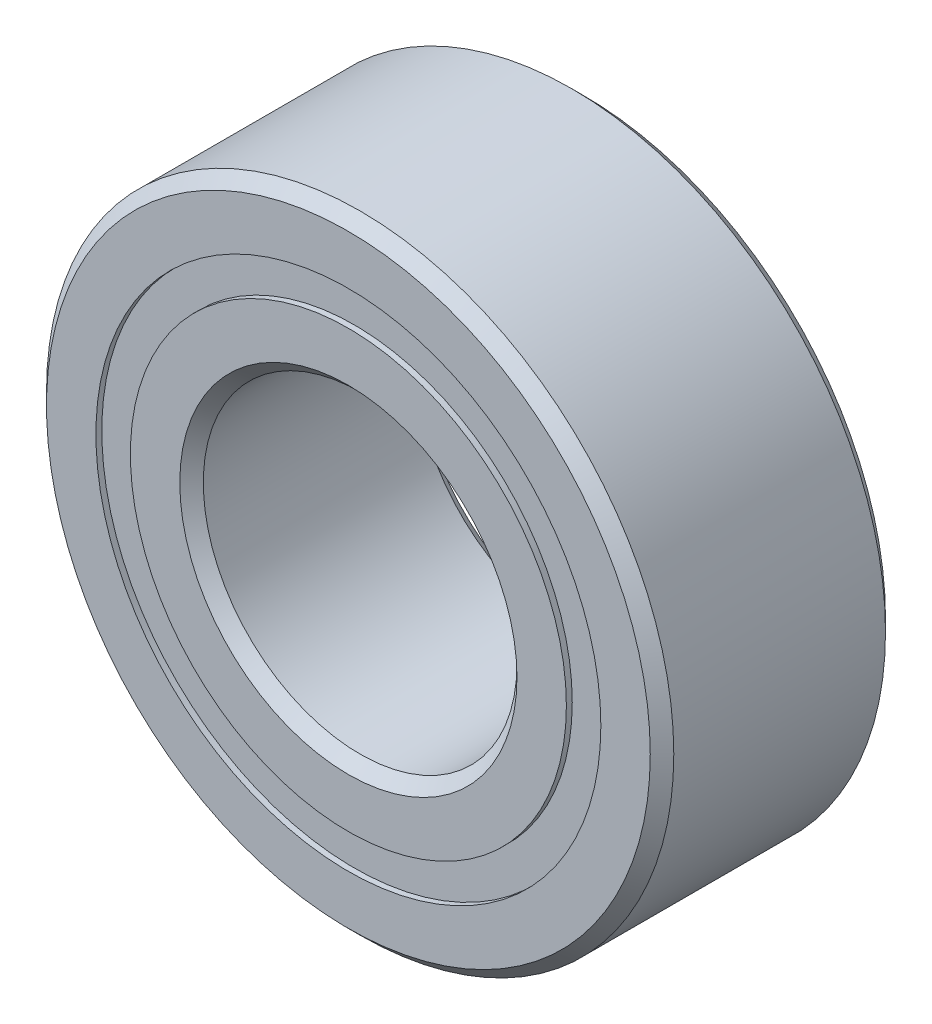
ISO-10303-21;
HEADER;
FILE_DESCRIPTION(('STEP AP214'),'2;1');
FILE_NAME('part.step','',(''),(''),'','','');
FILE_SCHEMA(('AUTOMOTIVE_DESIGN { 1 0 10303 214 1 1 1 1 }'));
ENDSEC;
DATA;
#1=APPLICATION_CONTEXT('core data for automotive mechanical design processes');
#2=APPLICATION_PROTOCOL_DEFINITION('international standard','automotive_design',2000,#1);
#3=PRODUCT_CONTEXT('',#1,'mechanical');
#4=PRODUCT('Part','Part','',(#3));
#5=PRODUCT_RELATED_PRODUCT_CATEGORY('part','',(#4));
#6=PRODUCT_DEFINITION_FORMATION('','',#4);
#7=PRODUCT_DEFINITION_CONTEXT('part definition',#1,'design');
#8=PRODUCT_DEFINITION('design','',#6,#7);
#9=PRODUCT_DEFINITION_SHAPE('','',#8);
#10=(LENGTH_UNIT() NAMED_UNIT(*) SI_UNIT(.MILLI.,.METRE.));
#11=(NAMED_UNIT(*) PLANE_ANGLE_UNIT() SI_UNIT($,.RADIAN.));
#12=(NAMED_UNIT(*) SI_UNIT($,.STERADIAN.) SOLID_ANGLE_UNIT());
#13=UNCERTAINTY_MEASURE_WITH_UNIT(LENGTH_MEASURE(1.E-05),#10,'distance_accuracy_value','');
#14=(GEOMETRIC_REPRESENTATION_CONTEXT(3) GLOBAL_UNCERTAINTY_ASSIGNED_CONTEXT((#13)) GLOBAL_UNIT_ASSIGNED_CONTEXT((#10,
#11,#12)) REPRESENTATION_CONTEXT('',''));
#15=CARTESIAN_POINT('',(0.,0.,0.));
#16=DIRECTION('',(0.,0.,1.));
#17=DIRECTION('',(1.,0.,0.));
#18=AXIS2_PLACEMENT_3D('',#15,#16,#17);
#19=CARTESIAN_POINT('',(0.,6.43956043956044,-2.85));
#20=DIRECTION('',(0.,0.,1.));
#21=DIRECTION('',(1.,0.,0.));
#22=AXIS2_PLACEMENT_3D('',#19,#20,#21);
#23=PLANE('',#22);
#24=CARTESIAN_POINT('',(0.,0.,-2.85));
#25=DIRECTION('',(0.,0.,1.));
#26=DIRECTION('',(1.,0.,0.));
#27=AXIS2_PLACEMENT_3D('',#24,#25,#26);
#28=CIRCLE('',#27,6.43956043956044);
#29=CARTESIAN_POINT('',(6.43956043956044,0.,-2.85));
#30=VERTEX_POINT('',#29);
#31=EDGE_CURVE('E55',#30,#30,#28,.T.);
#32=ORIENTED_EDGE('',*,*,#31,.F.);
#33=EDGE_LOOP('',(#32));
#34=FACE_BOUND('',#33,.T.);
#35=CARTESIAN_POINT('',(0.,0.,-2.85));
#36=DIRECTION('',(0.,0.,1.));
#37=DIRECTION('',(1.,0.,0.));
#38=AXIS2_PLACEMENT_3D('',#35,#36,#37);
#39=CIRCLE('',#38,5.56043956043956);
#40=CARTESIAN_POINT('',(5.56043956043956,0.,-2.85));
#41=VERTEX_POINT('',#40);
#42=EDGE_CURVE('E11',#41,#41,#39,.T.);
#43=ORIENTED_EDGE('',*,*,#42,.T.);
#44=EDGE_LOOP('',(#43));
#45=FACE_BOUND('',#44,.T.);
#46=ADVANCED_FACE('F41',(#34,#45),#23,.F.);
#47=CARTESIAN_POINT('',(0.,0.,3.));
#48=DIRECTION('',(0.,0.,1.));
#49=DIRECTION('',(1.,0.,0.));
#50=AXIS2_PLACEMENT_3D('',#47,#48,#49);
#51=CYLINDRICAL_SURFACE('',#50,5.56043956043956);
#52=ORIENTED_EDGE('',*,*,#42,.F.);
#53=EDGE_LOOP('',(#52));
#54=FACE_BOUND('',#53,.T.);
#55=CARTESIAN_POINT('',(0.,0.,-1.40391992570956));
#56=DIRECTION('',(0.,0.,1.));
#57=DIRECTION('',(1.,0.,0.));
#58=AXIS2_PLACEMENT_3D('',#55,#56,#57);
#59=CIRCLE('',#58,5.56043956043956);
#60=CARTESIAN_POINT('',(5.56043956043956,0.,-1.40391992570956));
#61=VERTEX_POINT('',#60);
#62=EDGE_CURVE('E47',#61,#61,#59,.T.);
#63=ORIENTED_EDGE('',*,*,#62,.T.);
#64=EDGE_LOOP('',(#63));
#65=FACE_BOUND('',#64,.T.);
#66=ADVANCED_FACE('F64',(#54,#65),#51,.F.);
#67=CARTESIAN_POINT('',(0.,6.43956043956044,-1.40391992570956));
#68=DIRECTION('',(0.,0.,-1.));
#69=DIRECTION('',(-1.,0.,0.));
#70=AXIS2_PLACEMENT_3D('',#67,#68,#69);
#71=PLANE('',#70);
#72=ORIENTED_EDGE('',*,*,#62,.F.);
#73=EDGE_LOOP('',(#72));
#74=FACE_BOUND('',#73,.T.);
#75=CARTESIAN_POINT('',(0.,0.,-1.40391992570956));
#76=DIRECTION('',(0.,0.,1.));
#77=DIRECTION('',(1.,0.,0.));
#78=AXIS2_PLACEMENT_3D('',#75,#76,#77);
#79=CIRCLE('',#78,6.43956043956044);
#80=CARTESIAN_POINT('',(6.43956043956044,0.,-1.40391992570956));
#81=VERTEX_POINT('',#80);
#82=EDGE_CURVE('E51',#81,#81,#79,.T.);
#83=ORIENTED_EDGE('',*,*,#82,.T.);
#84=EDGE_LOOP('',(#83));
#85=FACE_BOUND('',#84,.T.);
#86=ADVANCED_FACE('F68',(#74,#85),#71,.F.);
#87=CARTESIAN_POINT('',(0.,0.,3.));
#88=DIRECTION('',(0.,0.,1.));
#89=DIRECTION('',(1.,0.,0.));
#90=AXIS2_PLACEMENT_3D('',#87,#88,#89);
#91=CYLINDRICAL_SURFACE('',#90,6.43956043956044);
#92=ORIENTED_EDGE('',*,*,#82,.F.);
#93=EDGE_LOOP('',(#92));
#94=FACE_BOUND('',#93,.T.);
#95=ORIENTED_EDGE('',*,*,#31,.T.);
#96=EDGE_LOOP('',(#95));
#97=FACE_BOUND('',#96,.T.);
#98=ADVANCED_FACE('F61',(#94,#97),#91,.T.);
#99=CLOSED_SHELL('',(#46,#66,#86,#98));
#100=MANIFOLD_SOLID_BREP('B2',#99);
#101=CARTESIAN_POINT('',(0.,6.43956043956044,2.85));
#102=DIRECTION('',(0.,0.,-1.));
#103=DIRECTION('',(-1.,0.,0.));
#104=AXIS2_PLACEMENT_3D('',#101,#102,#103);
#105=PLANE('',#104);
#106=CARTESIAN_POINT('',(0.,0.,2.85));
#107=DIRECTION('',(0.,0.,1.));
#108=DIRECTION('',(1.,0.,0.));
#109=AXIS2_PLACEMENT_3D('',#106,#107,#108);
#110=CIRCLE('',#109,5.56043956043956);
#111=CARTESIAN_POINT('',(5.56043956043956,0.,2.85));
#112=VERTEX_POINT('',#111);
#113=EDGE_CURVE('E40',#112,#112,#110,.T.);
#114=ORIENTED_EDGE('',*,*,#113,.F.);
#115=EDGE_LOOP('',(#114));
#116=FACE_BOUND('',#115,.T.);
#117=CARTESIAN_POINT('',(0.,0.,2.85));
#118=DIRECTION('',(0.,0.,1.));
#119=DIRECTION('',(1.,0.,0.));
#120=AXIS2_PLACEMENT_3D('',#117,#118,#119);
#121=CIRCLE('',#120,6.43956043956044);
#122=CARTESIAN_POINT('',(6.43956043956044,0.,2.85));
#123=VERTEX_POINT('',#122);
#124=EDGE_CURVE('E122',#123,#123,#121,.T.);
#125=ORIENTED_EDGE('',*,*,#124,.T.);
#126=EDGE_LOOP('',(#125));
#127=FACE_BOUND('',#126,.T.);
#128=ADVANCED_FACE('F108',(#116,#127),#105,.F.);
#129=CARTESIAN_POINT('',(0.,0.,3.));
#130=DIRECTION('',(0.,0.,1.));
#131=DIRECTION('',(1.,0.,0.));
#132=AXIS2_PLACEMENT_3D('',#129,#130,#131);
#133=CYLINDRICAL_SURFACE('',#132,5.56043956043956);
#134=CARTESIAN_POINT('',(0.,0.,1.40391992570956));
#135=DIRECTION('',(0.,0.,1.));
#136=DIRECTION('',(1.,0.,0.));
#137=AXIS2_PLACEMENT_3D('',#134,#135,#136);
#138=CIRCLE('',#137,5.56043956043956);
#139=CARTESIAN_POINT('',(5.56043956043956,0.,1.40391992570956));
#140=VERTEX_POINT('',#139);
#141=EDGE_CURVE('E114',#140,#140,#138,.T.);
#142=ORIENTED_EDGE('',*,*,#141,.F.);
#143=EDGE_LOOP('',(#142));
#144=FACE_BOUND('',#143,.T.);
#145=ORIENTED_EDGE('',*,*,#113,.T.);
#146=EDGE_LOOP('',(#145));
#147=FACE_BOUND('',#146,.T.);
#148=ADVANCED_FACE('F137',(#144,#147),#133,.F.);
#149=CARTESIAN_POINT('',(0.,6.43956043956044,1.40391992570956));
#150=DIRECTION('',(0.,0.,1.));
#151=DIRECTION('',(1.,0.,0.));
#152=AXIS2_PLACEMENT_3D('',#149,#150,#151);
#153=PLANE('',#152);
#154=CARTESIAN_POINT('',(0.,0.,1.40391992570956));
#155=DIRECTION('',(0.,0.,1.));
#156=DIRECTION('',(1.,0.,0.));
#157=AXIS2_PLACEMENT_3D('',#154,#155,#156);
#158=CIRCLE('',#157,6.43956043956044);
#159=CARTESIAN_POINT('',(6.43956043956044,0.,1.40391992570956));
#160=VERTEX_POINT('',#159);
#161=EDGE_CURVE('E118',#160,#160,#158,.T.);
#162=ORIENTED_EDGE('',*,*,#161,.F.);
#163=EDGE_LOOP('',(#162));
#164=FACE_BOUND('',#163,.T.);
#165=ORIENTED_EDGE('',*,*,#141,.T.);
#166=EDGE_LOOP('',(#165));
#167=FACE_BOUND('',#166,.T.);
#168=ADVANCED_FACE('F132',(#164,#167),#153,.F.);
#169=CARTESIAN_POINT('',(0.,0.,3.));
#170=DIRECTION('',(0.,0.,1.));
#171=DIRECTION('',(1.,0.,0.));
#172=AXIS2_PLACEMENT_3D('',#169,#170,#171);
#173=CYLINDRICAL_SURFACE('',#172,6.43956043956044);
#174=ORIENTED_EDGE('',*,*,#124,.F.);
#175=EDGE_LOOP('',(#174));
#176=FACE_BOUND('',#175,.T.);
#177=ORIENTED_EDGE('',*,*,#161,.T.);
#178=EDGE_LOOP('',(#177));
#179=FACE_BOUND('',#178,.T.);
#180=ADVANCED_FACE('F129',(#176,#179),#173,.T.);
#181=CLOSED_SHELL('',(#128,#148,#168,#180));
#182=MANIFOLD_SOLID_BREP('B6',#181);
#183=CARTESIAN_POINT('',(-2.99999999999993,5.19615242270667,0.));
#184=DIRECTION('',(0.,0.,1.));
#185=DIRECTION('',(-0.499999999999989,0.866025403784445,0.));
#186=AXIS2_PLACEMENT_3D('',#183,#184,#185);
#187=SPHERICAL_SURFACE('',#186,1.40391992570956);
#188=CARTESIAN_POINT('',(-2.99999999999993,5.19615242270667,1.40391992570956));
#189=VERTEX_POINT('',#188);
#190=VERTEX_LOOP('',#189);
#191=FACE_BOUND('',#190,.T.);
#192=ADVANCED_FACE('F175',(#191),#187,.T.);
#193=CLOSED_SHELL('',(#192));
#194=MANIFOLD_SOLID_BREP('B35',#193);
#195=CARTESIAN_POINT('',(-5.1961524227066,3.00000000000006,0.));
#196=DIRECTION('',(0.,0.,1.));
#197=DIRECTION('',(-0.866025403784433,0.50000000000001,0.));
#198=AXIS2_PLACEMENT_3D('',#195,#196,#197);
#199=SPHERICAL_SURFACE('',#198,1.40391992570956);
#200=CARTESIAN_POINT('',(-5.1961524227066,3.00000000000006,1.40391992570956));
#201=VERTEX_POINT('',#200);
#202=VERTEX_LOOP('',#201);
#203=FACE_BOUND('',#202,.T.);
#204=ADVANCED_FACE('F195',(#203),#199,.T.);
#205=CLOSED_SHELL('',(#204));
#206=MANIFOLD_SOLID_BREP('B104',#205);
#207=CARTESIAN_POINT('',(-6.,0.,0.));
#208=DIRECTION('',(0.,0.,1.));
#209=DIRECTION('',(-1.,0.,0.));
#210=AXIS2_PLACEMENT_3D('',#207,#208,#209);
#211=SPHERICAL_SURFACE('',#210,1.40391992570956);
#212=CARTESIAN_POINT('',(-6.,0.,1.40391992570956));
#213=VERTEX_POINT('',#212);
#214=VERTEX_LOOP('',#213);
#215=FACE_BOUND('',#214,.T.);
#216=ADVANCED_FACE('F215',(#215),#211,.T.);
#217=CLOSED_SHELL('',(#216));
#218=MANIFOLD_SOLID_BREP('B171',#217);
#219=CARTESIAN_POINT('',(-5.19615242270666,-2.99999999999995,0.));
#220=DIRECTION('',(0.,0.,1.));
#221=DIRECTION('',(-0.866025403784443,-0.499999999999992,0.));
#222=AXIS2_PLACEMENT_3D('',#219,#220,#221);
#223=SPHERICAL_SURFACE('',#222,1.40391992570956);
#224=CARTESIAN_POINT('',(-5.19615242270666,-2.99999999999995,1.40391992570956));
#225=VERTEX_POINT('',#224);
#226=VERTEX_LOOP('',#225);
#227=FACE_BOUND('',#226,.T.);
#228=ADVANCED_FACE('F235',(#227),#223,.T.);
#229=CLOSED_SHELL('',(#228));
#230=MANIFOLD_SOLID_BREP('B191',#229);
#231=CARTESIAN_POINT('',(-3.00000000000004,-5.19615242270661,0.));
#232=DIRECTION('',(0.,0.,1.));
#233=DIRECTION('',(-0.500000000000007,-0.866025403784435,0.));
#234=AXIS2_PLACEMENT_3D('',#231,#232,#233);
#235=SPHERICAL_SURFACE('',#234,1.40391992570956);
#236=CARTESIAN_POINT('',(-3.00000000000004,-5.19615242270661,1.40391992570956));
#237=VERTEX_POINT('',#236);
#238=VERTEX_LOOP('',#237);
#239=FACE_BOUND('',#238,.T.);
#240=ADVANCED_FACE('F255',(#239),#235,.T.);
#241=CLOSED_SHELL('',(#240));
#242=MANIFOLD_SOLID_BREP('B211',#241);
#243=CARTESIAN_POINT('',(0.,-6.,0.));
#244=DIRECTION('',(0.,0.,1.));
#245=DIRECTION('',(0.,-1.,0.));
#246=AXIS2_PLACEMENT_3D('',#243,#244,#245);
#247=SPHERICAL_SURFACE('',#246,1.40391992570956);
#248=CARTESIAN_POINT('',(0.,-6.,1.40391992570956));
#249=VERTEX_POINT('',#248);
#250=VERTEX_LOOP('',#249);
#251=FACE_BOUND('',#250,.T.);
#252=ADVANCED_FACE('F275',(#251),#247,.T.);
#253=CLOSED_SHELL('',(#252));
#254=MANIFOLD_SOLID_BREP('B231',#253);
#255=CARTESIAN_POINT('',(2.99999999999997,-5.19615242270665,0.));
#256=DIRECTION('',(0.,0.,1.));
#257=DIRECTION('',(0.499999999999995,-0.866025403784442,0.));
#258=AXIS2_PLACEMENT_3D('',#255,#256,#257);
#259=SPHERICAL_SURFACE('',#258,1.40391992570956);
#260=CARTESIAN_POINT('',(2.99999999999997,-5.19615242270665,1.40391992570956));
#261=VERTEX_POINT('',#260);
#262=VERTEX_LOOP('',#261);
#263=FACE_BOUND('',#262,.T.);
#264=ADVANCED_FACE('F295',(#263),#259,.T.);
#265=CLOSED_SHELL('',(#264));
#266=MANIFOLD_SOLID_BREP('B251',#265);
#267=CARTESIAN_POINT('',(5.19615242270662,-3.00000000000002,0.));
#268=DIRECTION('',(0.,0.,1.));
#269=DIRECTION('',(0.866025403784436,-0.500000000000004,0.));
#270=AXIS2_PLACEMENT_3D('',#267,#268,#269);
#271=SPHERICAL_SURFACE('',#270,1.40391992570956);
#272=CARTESIAN_POINT('',(5.19615242270662,-3.00000000000002,1.40391992570956));
#273=VERTEX_POINT('',#272);
#274=VERTEX_LOOP('',#273);
#275=FACE_BOUND('',#274,.T.);
#276=ADVANCED_FACE('F315',(#275),#271,.T.);
#277=CLOSED_SHELL('',(#276));
#278=MANIFOLD_SOLID_BREP('B271',#277);
#279=CARTESIAN_POINT('',(6.,0.,0.));
#280=DIRECTION('',(0.,0.,1.));
#281=DIRECTION('',(1.,0.,0.));
#282=AXIS2_PLACEMENT_3D('',#279,#280,#281);
#283=SPHERICAL_SURFACE('',#282,1.40391992570956);
#284=CARTESIAN_POINT('',(6.,0.,1.40391992570956));
#285=VERTEX_POINT('',#284);
#286=VERTEX_LOOP('',#285);
#287=FACE_BOUND('',#286,.T.);
#288=ADVANCED_FACE('F335',(#287),#283,.T.);
#289=CLOSED_SHELL('',(#288));
#290=MANIFOLD_SOLID_BREP('B291',#289);
#291=CARTESIAN_POINT('',(5.19615242270664,2.99999999999999,0.));
#292=DIRECTION('',(0.,0.,1.));
#293=DIRECTION('',(0.86602540378444,0.499999999999998,0.));
#294=AXIS2_PLACEMENT_3D('',#291,#292,#293);
#295=SPHERICAL_SURFACE('',#294,1.40391992570956);
#296=CARTESIAN_POINT('',(5.19615242270664,2.99999999999999,1.40391992570956));
#297=VERTEX_POINT('',#296);
#298=VERTEX_LOOP('',#297);
#299=FACE_BOUND('',#298,.T.);
#300=ADVANCED_FACE('F355',(#299),#295,.T.);
#301=CLOSED_SHELL('',(#300));
#302=MANIFOLD_SOLID_BREP('B311',#301);
#303=CARTESIAN_POINT('',(3.00000000000001,5.19615242270663,0.));
#304=DIRECTION('',(0.,0.,1.));
#305=DIRECTION('',(0.500000000000001,0.866025403784438,0.));
#306=AXIS2_PLACEMENT_3D('',#303,#304,#305);
#307=SPHERICAL_SURFACE('',#306,1.40391992570956);
#308=CARTESIAN_POINT('',(3.00000000000001,5.19615242270663,1.40391992570956));
#309=VERTEX_POINT('',#308);
#310=VERTEX_LOOP('',#309);
#311=FACE_BOUND('',#310,.T.);
#312=ADVANCED_FACE('F375',(#311),#307,.T.);
#313=CLOSED_SHELL('',(#312));
#314=MANIFOLD_SOLID_BREP('B331',#313);
#315=CARTESIAN_POINT('',(0.,6.,0.));
#316=DIRECTION('',(0.,0.,1.));
#317=DIRECTION('',(0.,1.,0.));
#318=AXIS2_PLACEMENT_3D('',#315,#316,#317);
#319=SPHERICAL_SURFACE('',#318,1.40391992570956);
#320=CARTESIAN_POINT('',(0.,6.,1.40391992570956));
#321=VERTEX_POINT('',#320);
#322=VERTEX_LOOP('',#321);
#323=FACE_BOUND('',#322,.T.);
#324=ADVANCED_FACE('F397',(#323),#319,.T.);
#325=CLOSED_SHELL('',(#324));
#326=MANIFOLD_SOLID_BREP('B351',#325);
#327=CARTESIAN_POINT('',(0.,5.56043956043956,3.));
#328=DIRECTION('',(0.,0.,-1.));
#329=DIRECTION('',(-1.,0.,0.));
#330=AXIS2_PLACEMENT_3D('',#327,#328,#329);
#331=PLANE('',#330);
#332=CARTESIAN_POINT('',(0.,0.,3.));
#333=DIRECTION('',(0.,0.,1.));
#334=DIRECTION('',(1.,0.,0.));
#335=AXIS2_PLACEMENT_3D('',#332,#333,#334);
#336=CIRCLE('',#335,4.3);
#337=CARTESIAN_POINT('',(4.3,0.,3.));
#338=VERTEX_POINT('',#337);
#339=EDGE_CURVE('E444',#338,#338,#336,.T.);
#340=ORIENTED_EDGE('',*,*,#339,.F.);
#341=EDGE_LOOP('',(#340));
#342=FACE_BOUND('',#341,.T.);
#343=CARTESIAN_POINT('',(0.,0.,3.));
#344=DIRECTION('',(0.,0.,1.));
#345=DIRECTION('',(1.,0.,0.));
#346=AXIS2_PLACEMENT_3D('',#343,#344,#345);
#347=CIRCLE('',#346,5.56043956043956);
#348=CARTESIAN_POINT('',(5.56043956043956,0.,3.));
#349=VERTEX_POINT('',#348);
#350=EDGE_CURVE('E396',#349,#349,#347,.T.);
#351=ORIENTED_EDGE('',*,*,#350,.T.);
#352=EDGE_LOOP('',(#351));
#353=FACE_BOUND('',#352,.T.);
#354=ADVANCED_FACE('F416',(#342,#353),#331,.F.);
#355=CARTESIAN_POINT('',(0.,0.,3.));
#356=DIRECTION('',(0.,0.,1.));
#357=DIRECTION('',(1.,0.,0.));
#358=AXIS2_PLACEMENT_3D('',#355,#356,#357);
#359=CYLINDRICAL_SURFACE('',#358,5.56043956043956);
#360=ORIENTED_EDGE('',*,*,#350,.F.);
#361=EDGE_LOOP('',(#360));
#362=FACE_BOUND('',#361,.T.);
#363=CARTESIAN_POINT('',(0.,0.,1.33333333333333));
#364=DIRECTION('',(0.,0.,1.));
#365=DIRECTION('',(1.,0.,0.));
#366=AXIS2_PLACEMENT_3D('',#363,#364,#365);
#367=CIRCLE('',#366,5.56043956043956);
#368=CARTESIAN_POINT('',(5.56043956043956,0.,1.33333333333333));
#369=VERTEX_POINT('',#368);
#370=EDGE_CURVE('E422',#369,#369,#367,.T.);
#371=ORIENTED_EDGE('',*,*,#370,.T.);
#372=EDGE_LOOP('',(#371));
#373=FACE_BOUND('',#372,.T.);
#374=ADVANCED_FACE('F451',(#362,#373),#359,.T.);
#375=CARTESIAN_POINT('',(0.,0.,0.));
#376=DIRECTION('',(0.,0.,1.));
#377=DIRECTION('',(1.,0.,0.));
#378=AXIS2_PLACEMENT_3D('',#375,#376,#377);
#379=TOROIDAL_SURFACE('',#378,6.,1.40391992570956);
#380=ORIENTED_EDGE('',*,*,#370,.F.);
#381=EDGE_LOOP('',(#380));
#382=FACE_BOUND('',#381,.T.);
#383=CARTESIAN_POINT('',(0.,0.,-1.33333333333333));
#384=DIRECTION('',(0.,0.,1.));
#385=DIRECTION('',(1.,0.,0.));
#386=AXIS2_PLACEMENT_3D('',#383,#384,#385);
#387=CIRCLE('',#386,5.56043956043956);
#388=CARTESIAN_POINT('',(5.56043956043956,0.,-1.33333333333333));
#389=VERTEX_POINT('',#388);
#390=EDGE_CURVE('E426',#389,#389,#387,.T.);
#391=ORIENTED_EDGE('',*,*,#390,.T.);
#392=EDGE_LOOP('',(#391));
#393=FACE_BOUND('',#392,.T.);
#394=ADVANCED_FACE('F455',(#382,#393),#379,.F.);
#395=CARTESIAN_POINT('',(0.,0.,3.));
#396=DIRECTION('',(0.,0.,1.));
#397=DIRECTION('',(1.,0.,0.));
#398=AXIS2_PLACEMENT_3D('',#395,#396,#397);
#399=CYLINDRICAL_SURFACE('',#398,5.56043956043956);
#400=ORIENTED_EDGE('',*,*,#390,.F.);
#401=EDGE_LOOP('',(#400));
#402=FACE_BOUND('',#401,.T.);
#403=CARTESIAN_POINT('',(0.,0.,-3.));
#404=DIRECTION('',(0.,0.,1.));
#405=DIRECTION('',(1.,0.,0.));
#406=AXIS2_PLACEMENT_3D('',#403,#404,#405);
#407=CIRCLE('',#406,5.56043956043956);
#408=CARTESIAN_POINT('',(5.56043956043956,0.,-3.));
#409=VERTEX_POINT('',#408);
#410=EDGE_CURVE('E430',#409,#409,#407,.T.);
#411=ORIENTED_EDGE('',*,*,#410,.T.);
#412=EDGE_LOOP('',(#411));
#413=FACE_BOUND('',#412,.T.);
#414=ADVANCED_FACE('F460',(#402,#413),#399,.T.);
#415=CARTESIAN_POINT('',(0.,4.3,-3.));
#416=DIRECTION('',(0.,0.,1.));
#417=DIRECTION('',(1.,0.,0.));
#418=AXIS2_PLACEMENT_3D('',#415,#416,#417);
#419=PLANE('',#418);
#420=ORIENTED_EDGE('',*,*,#410,.F.);
#421=EDGE_LOOP('',(#420));
#422=FACE_BOUND('',#421,.T.);
#423=CARTESIAN_POINT('',(0.,0.,-3.));
#424=DIRECTION('',(0.,0.,1.));
#425=DIRECTION('',(1.,0.,0.));
#426=AXIS2_PLACEMENT_3D('',#423,#424,#425);
#427=CIRCLE('',#426,4.3);
#428=CARTESIAN_POINT('',(4.3,0.,-3.));
#429=VERTEX_POINT('',#428);
#430=EDGE_CURVE('E435',#429,#429,#427,.T.);
#431=ORIENTED_EDGE('',*,*,#430,.T.);
#432=EDGE_LOOP('',(#431));
#433=FACE_BOUND('',#432,.T.);
#434=ADVANCED_FACE('F466',(#422,#433),#419,.F.);
#435=CARTESIAN_POINT('',(0.,0.,-2.7));
#436=DIRECTION('',(0.,0.,-1.));
#437=DIRECTION('',(-1.,0.,0.));
#438=AXIS2_PLACEMENT_3D('',#435,#436,#437);
#439=CONICAL_SURFACE('',#438,4.,0.785398163397445);
#440=ORIENTED_EDGE('',*,*,#430,.F.);
#441=EDGE_LOOP('',(#440));
#442=FACE_BOUND('',#441,.T.);
#443=CARTESIAN_POINT('',(0.,0.,-2.7));
#444=DIRECTION('',(0.,0.,1.));
#445=DIRECTION('',(1.,0.,0.));
#446=AXIS2_PLACEMENT_3D('',#443,#444,#445);
#447=CIRCLE('',#446,4.);
#448=CARTESIAN_POINT('',(4.,0.,-2.7));
#449=VERTEX_POINT('',#448);
#450=EDGE_CURVE('E438',#449,#449,#447,.T.);
#451=ORIENTED_EDGE('',*,*,#450,.T.);
#452=EDGE_LOOP('',(#451));
#453=FACE_BOUND('',#452,.T.);
#454=ADVANCED_FACE('F470',(#442,#453),#439,.F.);
#455=CARTESIAN_POINT('',(0.,0.,3.));
#456=DIRECTION('',(0.,0.,1.));
#457=DIRECTION('',(1.,0.,0.));
#458=AXIS2_PLACEMENT_3D('',#455,#456,#457);
#459=CYLINDRICAL_SURFACE('',#458,4.);
#460=ORIENTED_EDGE('',*,*,#450,.F.);
#461=EDGE_LOOP('',(#460));
#462=FACE_BOUND('',#461,.T.);
#463=CARTESIAN_POINT('',(0.,0.,2.7));
#464=DIRECTION('',(0.,0.,1.));
#465=DIRECTION('',(1.,0.,0.));
#466=AXIS2_PLACEMENT_3D('',#463,#464,#465);
#467=CIRCLE('',#466,4.);
#468=CARTESIAN_POINT('',(4.,0.,2.7));
#469=VERTEX_POINT('',#468);
#470=EDGE_CURVE('E441',#469,#469,#467,.T.);
#471=ORIENTED_EDGE('',*,*,#470,.T.);
#472=EDGE_LOOP('',(#471));
#473=FACE_BOUND('',#472,.T.);
#474=ADVANCED_FACE('F474',(#462,#473),#459,.F.);
#475=CARTESIAN_POINT('',(0.,0.,3.));
#476=DIRECTION('',(0.,0.,1.));
#477=DIRECTION('',(1.,0.,0.));
#478=AXIS2_PLACEMENT_3D('',#475,#476,#477);
#479=CONICAL_SURFACE('',#478,4.3,0.785398163397453);
#480=ORIENTED_EDGE('',*,*,#470,.F.);
#481=EDGE_LOOP('',(#480));
#482=FACE_BOUND('',#481,.T.);
#483=ORIENTED_EDGE('',*,*,#339,.T.);
#484=EDGE_LOOP('',(#483));
#485=FACE_BOUND('',#484,.T.);
#486=ADVANCED_FACE('F448',(#482,#485),#479,.F.);
#487=CLOSED_SHELL('',(#354,#374,#394,#414,#434,#454,#474,#486));
#488=MANIFOLD_SOLID_BREP('B371',#487);
#489=CARTESIAN_POINT('',(0.,0.,2.7));
#490=DIRECTION('',(0.,0.,-1.));
#491=DIRECTION('',(-1.,0.,0.));
#492=AXIS2_PLACEMENT_3D('',#489,#490,#491);
#493=CONICAL_SURFACE('',#492,8.,0.785398163397447);
#494=CARTESIAN_POINT('',(0.,0.,3.));
#495=DIRECTION('',(0.,0.,1.));
#496=DIRECTION('',(1.,0.,0.));
#497=AXIS2_PLACEMENT_3D('',#494,#495,#496);
#498=CIRCLE('',#497,7.7);
#499=CARTESIAN_POINT('',(7.7,0.,3.));
#500=VERTEX_POINT('',#499);
#501=EDGE_CURVE('E565',#500,#500,#498,.T.);
#502=ORIENTED_EDGE('',*,*,#501,.F.);
#503=EDGE_LOOP('',(#502));
#504=FACE_BOUND('',#503,.T.);
#505=CARTESIAN_POINT('',(0.,0.,2.7));
#506=DIRECTION('',(0.,0.,1.));
#507=DIRECTION('',(1.,0.,0.));
#508=AXIS2_PLACEMENT_3D('',#505,#506,#507);
#509=CIRCLE('',#508,8.);
#510=CARTESIAN_POINT('',(8.,0.,2.7));
#511=VERTEX_POINT('',#510);
#512=EDGE_CURVE('E415',#511,#511,#509,.T.);
#513=ORIENTED_EDGE('',*,*,#512,.T.);
#514=EDGE_LOOP('',(#513));
#515=FACE_BOUND('',#514,.T.);
#516=ADVANCED_FACE('F537',(#504,#515),#493,.T.);
#517=CARTESIAN_POINT('',(0.,0.,3.));
#518=DIRECTION('',(0.,0.,1.));
#519=DIRECTION('',(1.,0.,0.));
#520=AXIS2_PLACEMENT_3D('',#517,#518,#519);
#521=CYLINDRICAL_SURFACE('',#520,8.);
#522=ORIENTED_EDGE('',*,*,#512,.F.);
#523=EDGE_LOOP('',(#522));
#524=FACE_BOUND('',#523,.T.);
#525=CARTESIAN_POINT('',(0.,0.,-2.7));
#526=DIRECTION('',(0.,0.,1.));
#527=DIRECTION('',(1.,0.,0.));
#528=AXIS2_PLACEMENT_3D('',#525,#526,#527);
#529=CIRCLE('',#528,8.);
#530=CARTESIAN_POINT('',(8.,0.,-2.7));
#531=VERTEX_POINT('',#530);
#532=EDGE_CURVE('E543',#531,#531,#529,.T.);
#533=ORIENTED_EDGE('',*,*,#532,.T.);
#534=EDGE_LOOP('',(#533));
#535=FACE_BOUND('',#534,.T.);
#536=ADVANCED_FACE('F572',(#524,#535),#521,.T.);
#537=CARTESIAN_POINT('',(0.,0.,-3.));
#538=DIRECTION('',(0.,0.,1.));
#539=DIRECTION('',(1.,0.,0.));
#540=AXIS2_PLACEMENT_3D('',#537,#538,#539);
#541=CONICAL_SURFACE('',#540,7.7,0.785398163397445);
#542=ORIENTED_EDGE('',*,*,#532,.F.);
#543=EDGE_LOOP('',(#542));
#544=FACE_BOUND('',#543,.T.);
#545=CARTESIAN_POINT('',(0.,0.,-3.));
#546=DIRECTION('',(0.,0.,1.));
#547=DIRECTION('',(1.,0.,0.));
#548=AXIS2_PLACEMENT_3D('',#545,#546,#547);
#549=CIRCLE('',#548,7.7);
#550=CARTESIAN_POINT('',(7.7,0.,-3.));
#551=VERTEX_POINT('',#550);
#552=EDGE_CURVE('E547',#551,#551,#549,.T.);
#553=ORIENTED_EDGE('',*,*,#552,.T.);
#554=EDGE_LOOP('',(#553));
#555=FACE_BOUND('',#554,.T.);
#556=ADVANCED_FACE('F576',(#544,#555),#541,.T.);
#557=CARTESIAN_POINT('',(0.,7.7,-3.));
#558=DIRECTION('',(0.,0.,1.));
#559=DIRECTION('',(1.,0.,0.));
#560=AXIS2_PLACEMENT_3D('',#557,#558,#559);
#561=PLANE('',#560);
#562=ORIENTED_EDGE('',*,*,#552,.F.);
#563=EDGE_LOOP('',(#562));
#564=FACE_BOUND('',#563,.T.);
#565=CARTESIAN_POINT('',(0.,0.,-3.));
#566=DIRECTION('',(0.,0.,1.));
#567=DIRECTION('',(1.,0.,0.));
#568=AXIS2_PLACEMENT_3D('',#565,#566,#567);
#569=CIRCLE('',#568,6.43956043956044);
#570=CARTESIAN_POINT('',(6.43956043956044,0.,-3.));
#571=VERTEX_POINT('',#570);
#572=EDGE_CURVE('E551',#571,#571,#569,.T.);
#573=ORIENTED_EDGE('',*,*,#572,.T.);
#574=EDGE_LOOP('',(#573));
#575=FACE_BOUND('',#574,.T.);
#576=ADVANCED_FACE('F581',(#564,#575),#561,.F.);
#577=CARTESIAN_POINT('',(0.,0.,3.));
#578=DIRECTION('',(0.,0.,1.));
#579=DIRECTION('',(1.,0.,0.));
#580=AXIS2_PLACEMENT_3D('',#577,#578,#579);
#581=CYLINDRICAL_SURFACE('',#580,6.43956043956044);
#582=ORIENTED_EDGE('',*,*,#572,.F.);
#583=EDGE_LOOP('',(#582));
#584=FACE_BOUND('',#583,.T.);
#585=CARTESIAN_POINT('',(0.,0.,-1.33333333333333));
#586=DIRECTION('',(0.,0.,1.));
#587=DIRECTION('',(1.,0.,0.));
#588=AXIS2_PLACEMENT_3D('',#585,#586,#587);
#589=CIRCLE('',#588,6.43956043956044);
#590=CARTESIAN_POINT('',(6.43956043956044,0.,-1.33333333333333));
#591=VERTEX_POINT('',#590);
#592=EDGE_CURVE('E556',#591,#591,#589,.T.);
#593=ORIENTED_EDGE('',*,*,#592,.T.);
#594=EDGE_LOOP('',(#593));
#595=FACE_BOUND('',#594,.T.);
#596=ADVANCED_FACE('F587',(#584,#595),#581,.F.);
#597=CARTESIAN_POINT('',(0.,0.,0.));
#598=DIRECTION('',(0.,0.,1.));
#599=DIRECTION('',(1.,0.,0.));
#600=AXIS2_PLACEMENT_3D('',#597,#598,#599);
#601=TOROIDAL_SURFACE('',#600,6.,1.40391992570956);
#602=ORIENTED_EDGE('',*,*,#592,.F.);
#603=EDGE_LOOP('',(#602));
#604=FACE_BOUND('',#603,.T.);
#605=CARTESIAN_POINT('',(0.,0.,1.33333333333333));
#606=DIRECTION('',(0.,0.,1.));
#607=DIRECTION('',(1.,0.,0.));
#608=AXIS2_PLACEMENT_3D('',#605,#606,#607);
#609=CIRCLE('',#608,6.43956043956044);
#610=CARTESIAN_POINT('',(6.43956043956044,0.,1.33333333333333));
#611=VERTEX_POINT('',#610);
#612=EDGE_CURVE('E559',#611,#611,#609,.T.);
#613=ORIENTED_EDGE('',*,*,#612,.T.);
#614=EDGE_LOOP('',(#613));
#615=FACE_BOUND('',#614,.T.);
#616=ADVANCED_FACE('F591',(#604,#615),#601,.F.);
#617=CARTESIAN_POINT('',(0.,0.,3.));
#618=DIRECTION('',(0.,0.,1.));
#619=DIRECTION('',(1.,0.,0.));
#620=AXIS2_PLACEMENT_3D('',#617,#618,#619);
#621=CYLINDRICAL_SURFACE('',#620,6.43956043956044);
#622=ORIENTED_EDGE('',*,*,#612,.F.);
#623=EDGE_LOOP('',(#622));
#624=FACE_BOUND('',#623,.T.);
#625=CARTESIAN_POINT('',(0.,0.,3.));
#626=DIRECTION('',(0.,0.,1.));
#627=DIRECTION('',(1.,0.,0.));
#628=AXIS2_PLACEMENT_3D('',#625,#626,#627);
#629=CIRCLE('',#628,6.43956043956044);
#630=CARTESIAN_POINT('',(6.43956043956044,0.,3.));
#631=VERTEX_POINT('',#630);
#632=EDGE_CURVE('E562',#631,#631,#629,.T.);
#633=ORIENTED_EDGE('',*,*,#632,.T.);
#634=EDGE_LOOP('',(#633));
#635=FACE_BOUND('',#634,.T.);
#636=ADVANCED_FACE('F595',(#624,#635),#621,.F.);
#637=CARTESIAN_POINT('',(0.,7.7,3.));
#638=DIRECTION('',(0.,0.,-1.));
#639=DIRECTION('',(-1.,0.,0.));
#640=AXIS2_PLACEMENT_3D('',#637,#638,#639);
#641=PLANE('',#640);
#642=ORIENTED_EDGE('',*,*,#632,.F.);
#643=EDGE_LOOP('',(#642));
#644=FACE_BOUND('',#643,.T.);
#645=ORIENTED_EDGE('',*,*,#501,.T.);
#646=EDGE_LOOP('',(#645));
#647=FACE_BOUND('',#646,.T.);
#648=ADVANCED_FACE('F569',(#644,#647),#641,.F.);
#649=CLOSED_SHELL('',(#516,#536,#556,#576,#596,#616,#636,#648));
#650=MANIFOLD_SOLID_BREP('B391',#649);
#651=ADVANCED_BREP_SHAPE_REPRESENTATION('',(#18,#100,#182,#194,#206,#218,#230,#242,#254,#266,
#278,#290,#302,#314,#326,#488,#650),#14);
#652=SHAPE_DEFINITION_REPRESENTATION(#9,#651);
ENDSEC;
END-ISO-10303-21;
